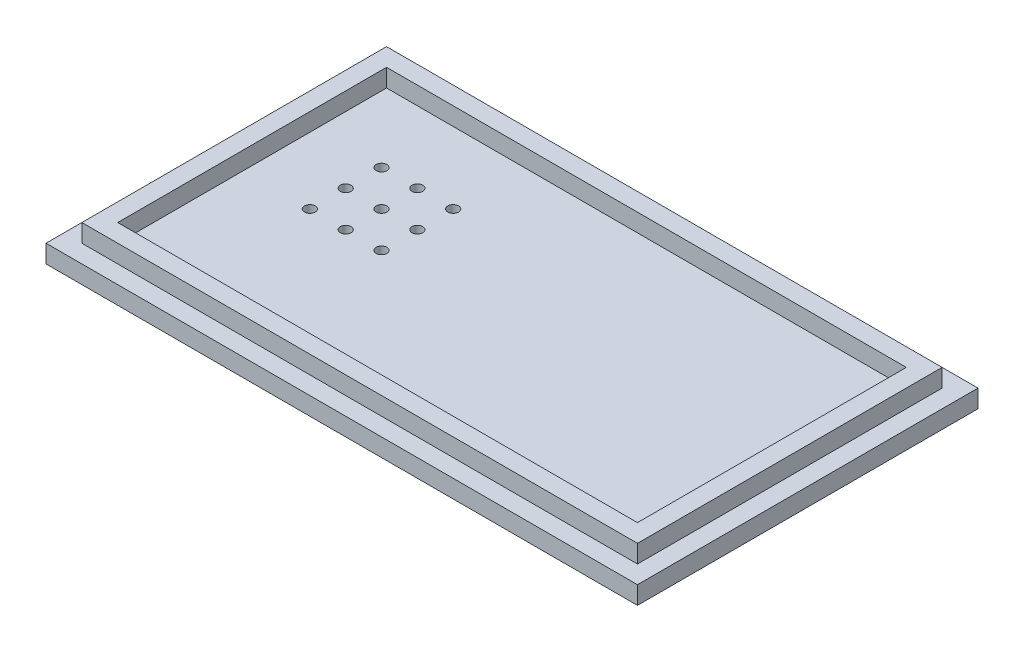
ISO-10303-21;
HEADER;
FILE_DESCRIPTION(('STEP AP214'),'2;1');
FILE_NAME('part.step','',(''),(''),'','','');
FILE_SCHEMA(('AUTOMOTIVE_DESIGN { 1 0 10303 214 1 1 1 1 }'));
ENDSEC;
DATA;
#1=APPLICATION_CONTEXT('core data for automotive mechanical design processes');
#2=APPLICATION_PROTOCOL_DEFINITION('international standard','automotive_design',2000,#1);
#3=PRODUCT_CONTEXT('',#1,'mechanical');
#4=PRODUCT('Part','Part','',(#3));
#5=PRODUCT_RELATED_PRODUCT_CATEGORY('part','',(#4));
#6=PRODUCT_DEFINITION_FORMATION('','',#4);
#7=PRODUCT_DEFINITION_CONTEXT('part definition',#1,'design');
#8=PRODUCT_DEFINITION('design','',#6,#7);
#9=PRODUCT_DEFINITION_SHAPE('','',#8);
#10=(LENGTH_UNIT() NAMED_UNIT(*) SI_UNIT(.MILLI.,.METRE.));
#11=(NAMED_UNIT(*) PLANE_ANGLE_UNIT() SI_UNIT($,.RADIAN.));
#12=(NAMED_UNIT(*) SI_UNIT($,.STERADIAN.) SOLID_ANGLE_UNIT());
#13=UNCERTAINTY_MEASURE_WITH_UNIT(LENGTH_MEASURE(1.E-05),#10,'distance_accuracy_value','');
#14=(GEOMETRIC_REPRESENTATION_CONTEXT(3) GLOBAL_UNCERTAINTY_ASSIGNED_CONTEXT((#13)) GLOBAL_UNIT_ASSIGNED_CONTEXT((#10,
#11,#12)) REPRESENTATION_CONTEXT('',''));
#15=CARTESIAN_POINT('',(0.,0.,0.));
#16=DIRECTION('',(0.,0.,1.));
#17=DIRECTION('',(1.,0.,0.));
#18=AXIS2_PLACEMENT_3D('',#15,#16,#17);
#19=CARTESIAN_POINT('',(0.,5.,0.));
#20=DIRECTION('',(0.,1.,0.));
#21=DIRECTION('',(0.,0.,1.));
#22=AXIS2_PLACEMENT_3D('',#19,#20,#21);
#23=PLANE('',#22);
#24=DIRECTION('',(0.,0.,-1.));
#25=VECTOR('',#24,1.);
#26=CARTESIAN_POINT('',(82.5,5.,-47.5));
#27=LINE('',#26,#25);
#28=CARTESIAN_POINT('',(82.5,5.,47.5));
#29=VERTEX_POINT('',#28);
#30=CARTESIAN_POINT('',(82.5,5.,-47.5));
#31=VERTEX_POINT('',#30);
#32=EDGE_CURVE('E192',#29,#31,#27,.T.);
#33=ORIENTED_EDGE('',*,*,#32,.T.);
#34=DIRECTION('',(-1.,0.,0.));
#35=VECTOR('',#34,1.);
#36=CARTESIAN_POINT('',(-82.5,5.,-47.5));
#37=LINE('',#36,#35);
#38=CARTESIAN_POINT('',(-82.5,5.,-47.5));
#39=VERTEX_POINT('',#38);
#40=EDGE_CURVE('E195',#31,#39,#37,.T.);
#41=ORIENTED_EDGE('',*,*,#40,.T.);
#42=DIRECTION('',(0.,0.,1.));
#43=VECTOR('',#42,1.);
#44=CARTESIAN_POINT('',(-82.5,5.,-47.5));
#45=LINE('',#44,#43);
#46=CARTESIAN_POINT('',(-82.5,5.,47.5));
#47=VERTEX_POINT('',#46);
#48=EDGE_CURVE('E198',#39,#47,#45,.T.);
#49=ORIENTED_EDGE('',*,*,#48,.T.);
#50=DIRECTION('',(1.,0.,0.));
#51=VECTOR('',#50,1.);
#52=CARTESIAN_POINT('',(-82.5,5.,47.5));
#53=LINE('',#52,#51);
#54=EDGE_CURVE('E200',#47,#29,#53,.T.);
#55=ORIENTED_EDGE('',*,*,#54,.T.);
#56=EDGE_LOOP('',(#33,#41,#49,#55));
#57=FACE_BOUND('',#56,.T.);
#58=DIRECTION('',(-1.,0.,0.));
#59=VECTOR('',#58,1.);
#60=CARTESIAN_POINT('',(-77.5,5.,-42.5));
#61=LINE('',#60,#59);
#62=CARTESIAN_POINT('',(77.5,5.,-42.5));
#63=VERTEX_POINT('',#62);
#64=CARTESIAN_POINT('',(-77.5,5.,-42.5));
#65=VERTEX_POINT('',#64);
#66=EDGE_CURVE('E178',#63,#65,#61,.T.);
#67=ORIENTED_EDGE('',*,*,#66,.F.);
#68=DIRECTION('',(0.,0.,-1.));
#69=VECTOR('',#68,1.);
#70=CARTESIAN_POINT('',(77.5,5.,-42.5));
#71=LINE('',#70,#69);
#72=CARTESIAN_POINT('',(77.5,5.,42.5));
#73=VERTEX_POINT('',#72);
#74=EDGE_CURVE('E141',#73,#63,#71,.T.);
#75=ORIENTED_EDGE('',*,*,#74,.F.);
#76=DIRECTION('',(1.,0.,0.));
#77=VECTOR('',#76,1.);
#78=CARTESIAN_POINT('',(-77.5,5.,42.5));
#79=LINE('',#78,#77);
#80=CARTESIAN_POINT('',(-77.5,5.,42.5));
#81=VERTEX_POINT('',#80);
#82=EDGE_CURVE('E169',#81,#73,#79,.T.);
#83=ORIENTED_EDGE('',*,*,#82,.F.);
#84=DIRECTION('',(0.,0.,1.));
#85=VECTOR('',#84,1.);
#86=CARTESIAN_POINT('',(-77.5,5.,-42.5));
#87=LINE('',#86,#85);
#88=EDGE_CURVE('E180',#65,#81,#87,.T.);
#89=ORIENTED_EDGE('',*,*,#88,.F.);
#90=EDGE_LOOP('',(#67,#75,#83,#89));
#91=FACE_BOUND('',#90,.T.);
#92=ADVANCED_FACE('F33',(#57,#91),#23,.T.);
#93=CARTESIAN_POINT('',(82.5,5.,-47.5));
#94=DIRECTION('',(-1.,0.,0.));
#95=DIRECTION('',(0.,0.,1.));
#96=AXIS2_PLACEMENT_3D('',#93,#94,#95);
#97=PLANE('',#96);
#98=DIRECTION('',(0.,0.,-1.));
#99=VECTOR('',#98,1.);
#100=CARTESIAN_POINT('',(82.5,0.,-47.5));
#101=LINE('',#100,#99);
#102=CARTESIAN_POINT('',(82.5,0.,47.5));
#103=VERTEX_POINT('',#102);
#104=CARTESIAN_POINT('',(82.5,0.,-47.5));
#105=VERTEX_POINT('',#104);
#106=EDGE_CURVE('E191',#103,#105,#101,.T.);
#107=ORIENTED_EDGE('',*,*,#106,.T.);
#108=DIRECTION('',(0.,-1.,0.));
#109=VECTOR('',#108,1.);
#110=CARTESIAN_POINT('',(82.5,5.,-47.5));
#111=LINE('',#110,#109);
#112=EDGE_CURVE('E11',#31,#105,#111,.T.);
#113=ORIENTED_EDGE('',*,*,#112,.F.);
#114=ORIENTED_EDGE('',*,*,#32,.F.);
#115=DIRECTION('',(0.,-1.,0.));
#116=VECTOR('',#115,1.);
#117=CARTESIAN_POINT('',(82.5,5.,47.5));
#118=LINE('',#117,#116);
#119=EDGE_CURVE('E202',#29,#103,#118,.T.);
#120=ORIENTED_EDGE('',*,*,#119,.T.);
#121=EDGE_LOOP('',(#107,#113,#114,#120));
#122=FACE_BOUND('',#121,.T.);
#123=ADVANCED_FACE('F35',(#122),#97,.F.);
#124=CARTESIAN_POINT('',(-82.5,5.,-47.5));
#125=DIRECTION('',(0.,0.,1.));
#126=DIRECTION('',(1.,0.,0.));
#127=AXIS2_PLACEMENT_3D('',#124,#125,#126);
#128=PLANE('',#127);
#129=DIRECTION('',(-1.,0.,0.));
#130=VECTOR('',#129,1.);
#131=CARTESIAN_POINT('',(-82.5,0.,-47.5));
#132=LINE('',#131,#130);
#133=CARTESIAN_POINT('',(-82.5,0.,-47.5));
#134=VERTEX_POINT('',#133);
#135=EDGE_CURVE('E205',#105,#134,#132,.T.);
#136=ORIENTED_EDGE('',*,*,#135,.T.);
#137=DIRECTION('',(0.,-1.,0.));
#138=VECTOR('',#137,1.);
#139=CARTESIAN_POINT('',(-82.5,5.,-47.5));
#140=LINE('',#139,#138);
#141=EDGE_CURVE('E41',#39,#134,#140,.T.);
#142=ORIENTED_EDGE('',*,*,#141,.F.);
#143=ORIENTED_EDGE('',*,*,#40,.F.);
#144=ORIENTED_EDGE('',*,*,#112,.T.);
#145=EDGE_LOOP('',(#136,#142,#143,#144));
#146=FACE_BOUND('',#145,.T.);
#147=ADVANCED_FACE('F235',(#146),#128,.F.);
#148=CARTESIAN_POINT('',(-82.5,5.,-47.5));
#149=DIRECTION('',(1.,0.,0.));
#150=DIRECTION('',(0.,0.,-1.));
#151=AXIS2_PLACEMENT_3D('',#148,#149,#150);
#152=PLANE('',#151);
#153=DIRECTION('',(0.,0.,1.));
#154=VECTOR('',#153,1.);
#155=CARTESIAN_POINT('',(-82.5,0.,-47.5));
#156=LINE('',#155,#154);
#157=CARTESIAN_POINT('',(-82.5,0.,47.5));
#158=VERTEX_POINT('',#157);
#159=EDGE_CURVE('E207',#134,#158,#156,.T.);
#160=ORIENTED_EDGE('',*,*,#159,.T.);
#161=DIRECTION('',(0.,-1.,0.));
#162=VECTOR('',#161,1.);
#163=CARTESIAN_POINT('',(-82.5,5.,47.5));
#164=LINE('',#163,#162);
#165=EDGE_CURVE('E212',#47,#158,#164,.T.);
#166=ORIENTED_EDGE('',*,*,#165,.F.);
#167=ORIENTED_EDGE('',*,*,#48,.F.);
#168=ORIENTED_EDGE('',*,*,#141,.T.);
#169=EDGE_LOOP('',(#160,#166,#167,#168));
#170=FACE_BOUND('',#169,.T.);
#171=ADVANCED_FACE('F219',(#170),#152,.F.);
#172=CARTESIAN_POINT('',(-82.5,5.,47.5));
#173=DIRECTION('',(0.,0.,-1.));
#174=DIRECTION('',(-1.,0.,0.));
#175=AXIS2_PLACEMENT_3D('',#172,#173,#174);
#176=PLANE('',#175);
#177=DIRECTION('',(1.,0.,0.));
#178=VECTOR('',#177,1.);
#179=CARTESIAN_POINT('',(-82.5,0.,47.5));
#180=LINE('',#179,#178);
#181=EDGE_CURVE('E196',#158,#103,#180,.T.);
#182=ORIENTED_EDGE('',*,*,#181,.T.);
#183=ORIENTED_EDGE('',*,*,#119,.F.);
#184=ORIENTED_EDGE('',*,*,#54,.F.);
#185=ORIENTED_EDGE('',*,*,#165,.T.);
#186=EDGE_LOOP('',(#182,#183,#184,#185));
#187=FACE_BOUND('',#186,.T.);
#188=ADVANCED_FACE('F228',(#187),#176,.F.);
#189=CARTESIAN_POINT('',(0.,0.,0.));
#190=DIRECTION('',(0.,1.,0.));
#191=DIRECTION('',(0.,0.,1.));
#192=AXIS2_PLACEMENT_3D('',#189,#190,#191);
#193=PLANE('',#192);
#194=CARTESIAN_POINT('',(-43.9734014380998,0.,-17.5727353519395));
#195=DIRECTION('',(0.,1.,0.));
#196=DIRECTION('',(0.,0.,1.));
#197=AXIS2_PLACEMENT_3D('',#194,#195,#196);
#198=CIRCLE('',#197,1.5);
#199=CARTESIAN_POINT('',(-43.9734014380998,0.,-16.0727353519395));
#200=VERTEX_POINT('',#199);
#201=EDGE_CURVE('E299',#200,#200,#198,.F.);
#202=ORIENTED_EDGE('',*,*,#201,.F.);
#203=EDGE_LOOP('',(#202));
#204=FACE_BOUND('',#203,.T.);
#205=CARTESIAN_POINT('',(-33.9734014380998,0.,-17.5727353519395));
#206=DIRECTION('',(0.,1.,0.));
#207=DIRECTION('',(0.,0.,1.));
#208=AXIS2_PLACEMENT_3D('',#205,#206,#207);
#209=CIRCLE('',#208,1.5);
#210=CARTESIAN_POINT('',(-33.9734014380998,0.,-16.0727353519395));
#211=VERTEX_POINT('',#210);
#212=EDGE_CURVE('E314',#211,#211,#209,.F.);
#213=ORIENTED_EDGE('',*,*,#212,.F.);
#214=EDGE_LOOP('',(#213));
#215=FACE_BOUND('',#214,.T.);
#216=CARTESIAN_POINT('',(-43.9734014380997,0.,-7.57273535193949));
#217=DIRECTION('',(0.,1.,0.));
#218=DIRECTION('',(0.,0.,1.));
#219=AXIS2_PLACEMENT_3D('',#216,#217,#218);
#220=CIRCLE('',#219,1.5);
#221=CARTESIAN_POINT('',(-43.9734014380997,0.,-6.07273535193948));
#222=VERTEX_POINT('',#221);
#223=EDGE_CURVE('E310',#222,#222,#220,.F.);
#224=ORIENTED_EDGE('',*,*,#223,.F.);
#225=EDGE_LOOP('',(#224));
#226=FACE_BOUND('',#225,.T.);
#227=CARTESIAN_POINT('',(-33.9734014380997,0.,-7.57273535193949));
#228=DIRECTION('',(0.,1.,0.));
#229=DIRECTION('',(0.,0.,1.));
#230=AXIS2_PLACEMENT_3D('',#227,#228,#229);
#231=CIRCLE('',#230,1.50000000000001);
#232=CARTESIAN_POINT('',(-33.9734014380997,0.,-6.07273535193948));
#233=VERTEX_POINT('',#232);
#234=EDGE_CURVE('E305',#233,#233,#231,.F.);
#235=ORIENTED_EDGE('',*,*,#234,.F.);
#236=EDGE_LOOP('',(#235));
#237=FACE_BOUND('',#236,.T.);
#238=CARTESIAN_POINT('',(-43.9734014380996,0.,2.42726464806051));
#239=DIRECTION('',(0.,1.,0.));
#240=DIRECTION('',(0.,0.,1.));
#241=AXIS2_PLACEMENT_3D('',#238,#239,#240);
#242=CIRCLE('',#241,1.5);
#243=CARTESIAN_POINT('',(-43.9734014380996,0.,3.92726464806052));
#244=VERTEX_POINT('',#243);
#245=EDGE_CURVE('E309',#244,#244,#242,.F.);
#246=ORIENTED_EDGE('',*,*,#245,.F.);
#247=EDGE_LOOP('',(#246));
#248=FACE_BOUND('',#247,.T.);
#249=CARTESIAN_POINT('',(-33.9734014380996,0.,2.42726464806051));
#250=DIRECTION('',(0.,1.,0.));
#251=DIRECTION('',(0.,0.,1.));
#252=AXIS2_PLACEMENT_3D('',#249,#250,#251);
#253=CIRCLE('',#252,1.5);
#254=CARTESIAN_POINT('',(-33.9734014380996,0.,3.92726464806051));
#255=VERTEX_POINT('',#254);
#256=EDGE_CURVE('E327',#255,#255,#253,.F.);
#257=ORIENTED_EDGE('',*,*,#256,.F.);
#258=EDGE_LOOP('',(#257));
#259=FACE_BOUND('',#258,.T.);
#260=CARTESIAN_POINT('',(-53.9734014380997,0.,-7.57273535193949));
#261=DIRECTION('',(0.,1.,0.));
#262=DIRECTION('',(0.,0.,1.));
#263=AXIS2_PLACEMENT_3D('',#260,#261,#262);
#264=CIRCLE('',#263,1.5);
#265=CARTESIAN_POINT('',(-53.9734014380997,0.,-6.07273535193948));
#266=VERTEX_POINT('',#265);
#267=EDGE_CURVE('E323',#266,#266,#264,.F.);
#268=ORIENTED_EDGE('',*,*,#267,.F.);
#269=EDGE_LOOP('',(#268));
#270=FACE_BOUND('',#269,.T.);
#271=CARTESIAN_POINT('',(-53.9734014380996,0.,2.42726464806051));
#272=DIRECTION('',(0.,1.,0.));
#273=DIRECTION('',(0.,0.,1.));
#274=AXIS2_PLACEMENT_3D('',#271,#272,#273);
#275=CIRCLE('',#274,1.5);
#276=CARTESIAN_POINT('',(-53.9734014380996,0.,3.92726464806052));
#277=VERTEX_POINT('',#276);
#278=EDGE_CURVE('E319',#277,#277,#275,.F.);
#279=ORIENTED_EDGE('',*,*,#278,.F.);
#280=EDGE_LOOP('',(#279));
#281=FACE_BOUND('',#280,.T.);
#282=CARTESIAN_POINT('',(-53.9734014380998,0.,-17.5727353519395));
#283=DIRECTION('',(0.,1.,0.));
#284=DIRECTION('',(0.,0.,1.));
#285=AXIS2_PLACEMENT_3D('',#282,#283,#284);
#286=CIRCLE('',#285,1.5);
#287=CARTESIAN_POINT('',(-53.9734014380998,0.,-16.0727353519395));
#288=VERTEX_POINT('',#287);
#289=EDGE_CURVE('E155',#288,#288,#286,.F.);
#290=ORIENTED_EDGE('',*,*,#289,.F.);
#291=EDGE_LOOP('',(#290));
#292=FACE_BOUND('',#291,.T.);
#293=ORIENTED_EDGE('',*,*,#106,.F.);
#294=ORIENTED_EDGE('',*,*,#181,.F.);
#295=ORIENTED_EDGE('',*,*,#159,.F.);
#296=ORIENTED_EDGE('',*,*,#135,.F.);
#297=EDGE_LOOP('',(#293,#294,#295,#296));
#298=FACE_BOUND('',#297,.T.);
#299=ADVANCED_FACE('F225',(#204,#215,#226,#237,#248,#259,#270,#281,#292,#298),#193,.F.);
#300=CARTESIAN_POINT('',(0.,10.,0.));
#301=DIRECTION('',(0.,1.,0.));
#302=DIRECTION('',(0.,0.,1.));
#303=AXIS2_PLACEMENT_3D('',#300,#301,#302);
#304=PLANE('',#303);
#305=DIRECTION('',(0.,0.,-1.));
#306=VECTOR('',#305,1.);
#307=CARTESIAN_POINT('',(77.5,10.,-42.5));
#308=LINE('',#307,#306);
#309=CARTESIAN_POINT('',(77.5,10.,42.5));
#310=VERTEX_POINT('',#309);
#311=CARTESIAN_POINT('',(77.5,10.,-42.5));
#312=VERTEX_POINT('',#311);
#313=EDGE_CURVE('E165',#310,#312,#308,.T.);
#314=ORIENTED_EDGE('',*,*,#313,.T.);
#315=DIRECTION('',(-1.,0.,0.));
#316=VECTOR('',#315,1.);
#317=CARTESIAN_POINT('',(-77.5,10.,-42.5));
#318=LINE('',#317,#316);
#319=CARTESIAN_POINT('',(-77.5,10.,-42.5));
#320=VERTEX_POINT('',#319);
#321=EDGE_CURVE('E168',#312,#320,#318,.T.);
#322=ORIENTED_EDGE('',*,*,#321,.T.);
#323=DIRECTION('',(0.,0.,1.));
#324=VECTOR('',#323,1.);
#325=CARTESIAN_POINT('',(-77.5,10.,-42.5));
#326=LINE('',#325,#324);
#327=CARTESIAN_POINT('',(-77.5,10.,42.5));
#328=VERTEX_POINT('',#327);
#329=EDGE_CURVE('E171',#320,#328,#326,.T.);
#330=ORIENTED_EDGE('',*,*,#329,.T.);
#331=DIRECTION('',(1.,0.,0.));
#332=VECTOR('',#331,1.);
#333=CARTESIAN_POINT('',(-77.5,10.,42.5));
#334=LINE('',#333,#332);
#335=EDGE_CURVE('E173',#328,#310,#334,.T.);
#336=ORIENTED_EDGE('',*,*,#335,.T.);
#337=EDGE_LOOP('',(#314,#322,#330,#336));
#338=FACE_BOUND('',#337,.T.);
#339=DIRECTION('',(-1.,0.,0.));
#340=VECTOR('',#339,1.);
#341=CARTESIAN_POINT('',(-72.5,10.,-37.5));
#342=LINE('',#341,#340);
#343=CARTESIAN_POINT('',(72.5,10.,-37.5));
#344=VERTEX_POINT('',#343);
#345=CARTESIAN_POINT('',(-72.5,10.,-37.5));
#346=VERTEX_POINT('',#345);
#347=EDGE_CURVE('E133',#344,#346,#342,.T.);
#348=ORIENTED_EDGE('',*,*,#347,.F.);
#349=DIRECTION('',(0.,0.,-1.));
#350=VECTOR('',#349,1.);
#351=CARTESIAN_POINT('',(72.5,10.,-37.5));
#352=LINE('',#351,#350);
#353=CARTESIAN_POINT('',(72.5,10.,37.5));
#354=VERTEX_POINT('',#353);
#355=EDGE_CURVE('E124',#354,#344,#352,.T.);
#356=ORIENTED_EDGE('',*,*,#355,.F.);
#357=DIRECTION('',(1.,0.,0.));
#358=VECTOR('',#357,1.);
#359=CARTESIAN_POINT('',(-72.5,10.,37.5));
#360=LINE('',#359,#358);
#361=CARTESIAN_POINT('',(-72.5,10.,37.5));
#362=VERTEX_POINT('',#361);
#363=EDGE_CURVE('E149',#362,#354,#360,.T.);
#364=ORIENTED_EDGE('',*,*,#363,.F.);
#365=DIRECTION('',(0.,0.,1.));
#366=VECTOR('',#365,1.);
#367=CARTESIAN_POINT('',(-72.5,10.,-37.5));
#368=LINE('',#367,#366);
#369=EDGE_CURVE('E147',#346,#362,#368,.T.);
#370=ORIENTED_EDGE('',*,*,#369,.F.);
#371=EDGE_LOOP('',(#348,#356,#364,#370));
#372=FACE_BOUND('',#371,.T.);
#373=ADVANCED_FACE('F145',(#338,#372),#304,.T.);
#374=CARTESIAN_POINT('',(77.5,10.,-42.5));
#375=DIRECTION('',(-1.,0.,0.));
#376=DIRECTION('',(0.,0.,1.));
#377=AXIS2_PLACEMENT_3D('',#374,#375,#376);
#378=PLANE('',#377);
#379=ORIENTED_EDGE('',*,*,#74,.T.);
#380=DIRECTION('',(0.,-1.,0.));
#381=VECTOR('',#380,1.);
#382=CARTESIAN_POINT('',(77.5,10.,-42.5));
#383=LINE('',#382,#381);
#384=EDGE_CURVE('E189',#312,#63,#383,.T.);
#385=ORIENTED_EDGE('',*,*,#384,.F.);
#386=ORIENTED_EDGE('',*,*,#313,.F.);
#387=DIRECTION('',(0.,-1.,0.));
#388=VECTOR('',#387,1.);
#389=CARTESIAN_POINT('',(77.5,10.,42.5));
#390=LINE('',#389,#388);
#391=EDGE_CURVE('E175',#310,#73,#390,.T.);
#392=ORIENTED_EDGE('',*,*,#391,.T.);
#393=EDGE_LOOP('',(#379,#385,#386,#392));
#394=FACE_BOUND('',#393,.T.);
#395=ADVANCED_FACE('F378',(#394),#378,.F.);
#396=CARTESIAN_POINT('',(-77.5,10.,-42.5));
#397=DIRECTION('',(0.,0.,1.));
#398=DIRECTION('',(1.,0.,0.));
#399=AXIS2_PLACEMENT_3D('',#396,#397,#398);
#400=PLANE('',#399);
#401=ORIENTED_EDGE('',*,*,#66,.T.);
#402=DIRECTION('',(0.,-1.,0.));
#403=VECTOR('',#402,1.);
#404=CARTESIAN_POINT('',(-77.5,10.,-42.5));
#405=LINE('',#404,#403);
#406=EDGE_CURVE('E186',#320,#65,#405,.T.);
#407=ORIENTED_EDGE('',*,*,#406,.F.);
#408=ORIENTED_EDGE('',*,*,#321,.F.);
#409=ORIENTED_EDGE('',*,*,#384,.T.);
#410=EDGE_LOOP('',(#401,#407,#408,#409));
#411=FACE_BOUND('',#410,.T.);
#412=ADVANCED_FACE('F385',(#411),#400,.F.);
#413=CARTESIAN_POINT('',(-77.5,10.,-42.5));
#414=DIRECTION('',(1.,0.,0.));
#415=DIRECTION('',(0.,0.,-1.));
#416=AXIS2_PLACEMENT_3D('',#413,#414,#415);
#417=PLANE('',#416);
#418=ORIENTED_EDGE('',*,*,#88,.T.);
#419=DIRECTION('',(0.,-1.,0.));
#420=VECTOR('',#419,1.);
#421=CARTESIAN_POINT('',(-77.5,10.,42.5));
#422=LINE('',#421,#420);
#423=EDGE_CURVE('E48',#328,#81,#422,.T.);
#424=ORIENTED_EDGE('',*,*,#423,.F.);
#425=ORIENTED_EDGE('',*,*,#329,.F.);
#426=ORIENTED_EDGE('',*,*,#406,.T.);
#427=EDGE_LOOP('',(#418,#424,#425,#426));
#428=FACE_BOUND('',#427,.T.);
#429=ADVANCED_FACE('F382',(#428),#417,.F.);
#430=CARTESIAN_POINT('',(-77.5,10.,42.5));
#431=DIRECTION('',(0.,0.,-1.));
#432=DIRECTION('',(-1.,0.,0.));
#433=AXIS2_PLACEMENT_3D('',#430,#431,#432);
#434=PLANE('',#433);
#435=ORIENTED_EDGE('',*,*,#82,.T.);
#436=ORIENTED_EDGE('',*,*,#391,.F.);
#437=ORIENTED_EDGE('',*,*,#335,.F.);
#438=ORIENTED_EDGE('',*,*,#423,.T.);
#439=EDGE_LOOP('',(#435,#436,#437,#438));
#440=FACE_BOUND('',#439,.T.);
#441=ADVANCED_FACE('F375',(#440),#434,.F.);
#442=CARTESIAN_POINT('',(72.5,10.,-37.5));
#443=DIRECTION('',(-1.,0.,0.));
#444=DIRECTION('',(0.,0.,1.));
#445=AXIS2_PLACEMENT_3D('',#442,#443,#444);
#446=PLANE('',#445);
#447=DIRECTION('',(0.,0.,-1.));
#448=VECTOR('',#447,1.);
#449=CARTESIAN_POINT('',(72.5,5.,-37.5));
#450=LINE('',#449,#448);
#451=CARTESIAN_POINT('',(72.5,5.,37.5));
#452=VERTEX_POINT('',#451);
#453=CARTESIAN_POINT('',(72.5,5.,-37.5));
#454=VERTEX_POINT('',#453);
#455=EDGE_CURVE('E56',#452,#454,#450,.T.);
#456=ORIENTED_EDGE('',*,*,#455,.F.);
#457=DIRECTION('',(0.,-1.,0.));
#458=VECTOR('',#457,1.);
#459=CARTESIAN_POINT('',(72.5,10.,37.5));
#460=LINE('',#459,#458);
#461=EDGE_CURVE('E129',#354,#452,#460,.T.);
#462=ORIENTED_EDGE('',*,*,#461,.F.);
#463=ORIENTED_EDGE('',*,*,#355,.T.);
#464=DIRECTION('',(0.,-1.,0.));
#465=VECTOR('',#464,1.);
#466=CARTESIAN_POINT('',(72.5,10.,-37.5));
#467=LINE('',#466,#465);
#468=EDGE_CURVE('E127',#344,#454,#467,.T.);
#469=ORIENTED_EDGE('',*,*,#468,.T.);
#470=EDGE_LOOP('',(#456,#462,#463,#469));
#471=FACE_BOUND('',#470,.T.);
#472=ADVANCED_FACE('F126',(#471),#446,.T.);
#473=CARTESIAN_POINT('',(-72.5,10.,-37.5));
#474=DIRECTION('',(0.,0.,1.));
#475=DIRECTION('',(1.,0.,0.));
#476=AXIS2_PLACEMENT_3D('',#473,#474,#475);
#477=PLANE('',#476);
#478=DIRECTION('',(-1.,0.,0.));
#479=VECTOR('',#478,1.);
#480=CARTESIAN_POINT('',(-72.5,5.,-37.5));
#481=LINE('',#480,#479);
#482=CARTESIAN_POINT('',(-72.5,5.,-37.5));
#483=VERTEX_POINT('',#482);
#484=EDGE_CURVE('E140',#454,#483,#481,.T.);
#485=ORIENTED_EDGE('',*,*,#484,.F.);
#486=ORIENTED_EDGE('',*,*,#468,.F.);
#487=ORIENTED_EDGE('',*,*,#347,.T.);
#488=DIRECTION('',(0.,-1.,0.));
#489=VECTOR('',#488,1.);
#490=CARTESIAN_POINT('',(-72.5,10.,-37.5));
#491=LINE('',#490,#489);
#492=EDGE_CURVE('E142',#346,#483,#491,.T.);
#493=ORIENTED_EDGE('',*,*,#492,.T.);
#494=EDGE_LOOP('',(#485,#486,#487,#493));
#495=FACE_BOUND('',#494,.T.);
#496=ADVANCED_FACE('F137',(#495),#477,.T.);
#497=CARTESIAN_POINT('',(-72.5,10.,-37.5));
#498=DIRECTION('',(1.,0.,0.));
#499=DIRECTION('',(0.,0.,-1.));
#500=AXIS2_PLACEMENT_3D('',#497,#498,#499);
#501=PLANE('',#500);
#502=DIRECTION('',(0.,0.,1.));
#503=VECTOR('',#502,1.);
#504=CARTESIAN_POINT('',(-72.5,5.,-37.5));
#505=LINE('',#504,#503);
#506=CARTESIAN_POINT('',(-72.5,5.,37.5));
#507=VERTEX_POINT('',#506);
#508=EDGE_CURVE('E157',#483,#507,#505,.T.);
#509=ORIENTED_EDGE('',*,*,#508,.F.);
#510=ORIENTED_EDGE('',*,*,#492,.F.);
#511=ORIENTED_EDGE('',*,*,#369,.T.);
#512=DIRECTION('',(0.,-1.,0.));
#513=VECTOR('',#512,1.);
#514=CARTESIAN_POINT('',(-72.5,10.,37.5));
#515=LINE('',#514,#513);
#516=EDGE_CURVE('E161',#362,#507,#515,.T.);
#517=ORIENTED_EDGE('',*,*,#516,.T.);
#518=EDGE_LOOP('',(#509,#510,#511,#517));
#519=FACE_BOUND('',#518,.T.);
#520=ADVANCED_FACE('F260',(#519),#501,.T.);
#521=CARTESIAN_POINT('',(-72.5,10.,37.5));
#522=DIRECTION('',(0.,0.,-1.));
#523=DIRECTION('',(-1.,0.,0.));
#524=AXIS2_PLACEMENT_3D('',#521,#522,#523);
#525=PLANE('',#524);
#526=DIRECTION('',(1.,0.,0.));
#527=VECTOR('',#526,1.);
#528=CARTESIAN_POINT('',(-72.5,5.,37.5));
#529=LINE('',#528,#527);
#530=EDGE_CURVE('E134',#507,#452,#529,.T.);
#531=ORIENTED_EDGE('',*,*,#530,.F.);
#532=ORIENTED_EDGE('',*,*,#516,.F.);
#533=ORIENTED_EDGE('',*,*,#363,.T.);
#534=ORIENTED_EDGE('',*,*,#461,.T.);
#535=EDGE_LOOP('',(#531,#532,#533,#534));
#536=FACE_BOUND('',#535,.T.);
#537=ADVANCED_FACE('F251',(#536),#525,.T.);
#538=CARTESIAN_POINT('',(-43.9734014380998,5.,-17.5727353519395));
#539=DIRECTION('',(0.,1.,0.));
#540=DIRECTION('',(0.,0.,1.));
#541=AXIS2_PLACEMENT_3D('',#538,#539,#540);
#542=CIRCLE('',#541,1.5);
#543=CARTESIAN_POINT('',(-43.9734014380998,5.,-16.0727353519395));
#544=VERTEX_POINT('',#543);
#545=EDGE_CURVE('E266',#544,#544,#542,.T.);
#546=ORIENTED_EDGE('',*,*,#545,.F.);
#547=EDGE_LOOP('',(#546));
#548=FACE_BOUND('',#547,.T.);
#549=CARTESIAN_POINT('',(-33.9734014380998,5.,-17.5727353519395));
#550=DIRECTION('',(0.,1.,0.));
#551=DIRECTION('',(0.,0.,1.));
#552=AXIS2_PLACEMENT_3D('',#549,#550,#551);
#553=CIRCLE('',#552,1.5);
#554=CARTESIAN_POINT('',(-33.9734014380998,5.,-16.0727353519395));
#555=VERTEX_POINT('',#554);
#556=EDGE_CURVE('E270',#555,#555,#553,.T.);
#557=ORIENTED_EDGE('',*,*,#556,.F.);
#558=EDGE_LOOP('',(#557));
#559=FACE_BOUND('',#558,.T.);
#560=CARTESIAN_POINT('',(-43.9734014380997,5.,-7.57273535193949));
#561=DIRECTION('',(0.,1.,0.));
#562=DIRECTION('',(0.,0.,1.));
#563=AXIS2_PLACEMENT_3D('',#560,#561,#562);
#564=CIRCLE('',#563,1.5);
#565=CARTESIAN_POINT('',(-43.9734014380997,5.,-6.07273535193948));
#566=VERTEX_POINT('',#565);
#567=EDGE_CURVE('E274',#566,#566,#564,.T.);
#568=ORIENTED_EDGE('',*,*,#567,.F.);
#569=EDGE_LOOP('',(#568));
#570=FACE_BOUND('',#569,.T.);
#571=CARTESIAN_POINT('',(-33.9734014380997,5.,-7.57273535193949));
#572=DIRECTION('',(0.,1.,0.));
#573=DIRECTION('',(0.,0.,1.));
#574=AXIS2_PLACEMENT_3D('',#571,#572,#573);
#575=CIRCLE('',#574,1.50000000000001);
#576=CARTESIAN_POINT('',(-33.9734014380997,5.,-6.07273535193948));
#577=VERTEX_POINT('',#576);
#578=EDGE_CURVE('E278',#577,#577,#575,.T.);
#579=ORIENTED_EDGE('',*,*,#578,.F.);
#580=EDGE_LOOP('',(#579));
#581=FACE_BOUND('',#580,.T.);
#582=CARTESIAN_POINT('',(-43.9734014380996,5.,2.42726464806051));
#583=DIRECTION('',(0.,1.,0.));
#584=DIRECTION('',(0.,0.,1.));
#585=AXIS2_PLACEMENT_3D('',#582,#583,#584);
#586=CIRCLE('',#585,1.5);
#587=CARTESIAN_POINT('',(-43.9734014380996,5.,3.92726464806052));
#588=VERTEX_POINT('',#587);
#589=EDGE_CURVE('E282',#588,#588,#586,.T.);
#590=ORIENTED_EDGE('',*,*,#589,.F.);
#591=EDGE_LOOP('',(#590));
#592=FACE_BOUND('',#591,.T.);
#593=CARTESIAN_POINT('',(-33.9734014380996,5.,2.42726464806051));
#594=DIRECTION('',(0.,1.,0.));
#595=DIRECTION('',(0.,0.,1.));
#596=AXIS2_PLACEMENT_3D('',#593,#594,#595);
#597=CIRCLE('',#596,1.5);
#598=CARTESIAN_POINT('',(-33.9734014380996,5.,3.92726464806051));
#599=VERTEX_POINT('',#598);
#600=EDGE_CURVE('E286',#599,#599,#597,.T.);
#601=ORIENTED_EDGE('',*,*,#600,.F.);
#602=EDGE_LOOP('',(#601));
#603=FACE_BOUND('',#602,.T.);
#604=CARTESIAN_POINT('',(-53.9734014380997,5.,-7.57273535193949));
#605=DIRECTION('',(0.,1.,0.));
#606=DIRECTION('',(0.,0.,1.));
#607=AXIS2_PLACEMENT_3D('',#604,#605,#606);
#608=CIRCLE('',#607,1.5);
#609=CARTESIAN_POINT('',(-53.9734014380997,5.,-6.07273535193948));
#610=VERTEX_POINT('',#609);
#611=EDGE_CURVE('E290',#610,#610,#608,.T.);
#612=ORIENTED_EDGE('',*,*,#611,.F.);
#613=EDGE_LOOP('',(#612));
#614=FACE_BOUND('',#613,.T.);
#615=CARTESIAN_POINT('',(-53.9734014380996,5.,2.42726464806051));
#616=DIRECTION('',(0.,1.,0.));
#617=DIRECTION('',(0.,0.,1.));
#618=AXIS2_PLACEMENT_3D('',#615,#616,#617);
#619=CIRCLE('',#618,1.5);
#620=CARTESIAN_POINT('',(-53.9734014380996,5.,3.92726464806052));
#621=VERTEX_POINT('',#620);
#622=EDGE_CURVE('E294',#621,#621,#619,.T.);
#623=ORIENTED_EDGE('',*,*,#622,.F.);
#624=EDGE_LOOP('',(#623));
#625=FACE_BOUND('',#624,.T.);
#626=CARTESIAN_POINT('',(-53.9734014380998,5.,-17.5727353519395));
#627=DIRECTION('',(0.,1.,0.));
#628=DIRECTION('',(0.,0.,1.));
#629=AXIS2_PLACEMENT_3D('',#626,#627,#628);
#630=CIRCLE('',#629,1.5);
#631=CARTESIAN_POINT('',(-53.9734014380998,5.,-16.0727353519395));
#632=VERTEX_POINT('',#631);
#633=EDGE_CURVE('E297',#632,#632,#630,.T.);
#634=ORIENTED_EDGE('',*,*,#633,.F.);
#635=EDGE_LOOP('',(#634));
#636=FACE_BOUND('',#635,.T.);
#637=ORIENTED_EDGE('',*,*,#455,.T.);
#638=ORIENTED_EDGE('',*,*,#484,.T.);
#639=ORIENTED_EDGE('',*,*,#508,.T.);
#640=ORIENTED_EDGE('',*,*,#530,.T.);
#641=EDGE_LOOP('',(#637,#638,#639,#640));
#642=FACE_BOUND('',#641,.T.);
#643=ADVANCED_FACE('F244',(#548,#559,#570,#581,#592,#603,#614,#625,#636,#642),#23,.T.);
#644=CARTESIAN_POINT('',(-53.9734014380998,-4.24264068711931,-17.5727353519395));
#645=DIRECTION('',(0.,1.,0.));
#646=DIRECTION('',(0.,0.,1.));
#647=AXIS2_PLACEMENT_3D('',#644,#645,#646);
#648=CYLINDRICAL_SURFACE('',#647,1.5);
#649=ORIENTED_EDGE('',*,*,#289,.T.);
#650=EDGE_LOOP('',(#649));
#651=FACE_BOUND('',#650,.T.);
#652=ORIENTED_EDGE('',*,*,#633,.T.);
#653=EDGE_LOOP('',(#652));
#654=FACE_BOUND('',#653,.T.);
#655=ADVANCED_FACE('F250',(#651,#654),#648,.F.);
#656=CARTESIAN_POINT('',(-53.9734014380996,-4.24264068711931,2.42726464806051));
#657=DIRECTION('',(0.,1.,0.));
#658=DIRECTION('',(0.,0.,1.));
#659=AXIS2_PLACEMENT_3D('',#656,#657,#658);
#660=CYLINDRICAL_SURFACE('',#659,1.5);
#661=ORIENTED_EDGE('',*,*,#278,.T.);
#662=EDGE_LOOP('',(#661));
#663=FACE_BOUND('',#662,.T.);
#664=ORIENTED_EDGE('',*,*,#622,.T.);
#665=EDGE_LOOP('',(#664));
#666=FACE_BOUND('',#665,.T.);
#667=ADVANCED_FACE('F257',(#663,#666),#660,.F.);
#668=CARTESIAN_POINT('',(-53.9734014380997,-4.24264068711931,-7.57273535193949));
#669=DIRECTION('',(0.,1.,0.));
#670=DIRECTION('',(0.,0.,1.));
#671=AXIS2_PLACEMENT_3D('',#668,#669,#670);
#672=CYLINDRICAL_SURFACE('',#671,1.5);
#673=ORIENTED_EDGE('',*,*,#267,.T.);
#674=EDGE_LOOP('',(#673));
#675=FACE_BOUND('',#674,.T.);
#676=ORIENTED_EDGE('',*,*,#611,.T.);
#677=EDGE_LOOP('',(#676));
#678=FACE_BOUND('',#677,.T.);
#679=ADVANCED_FACE('F347',(#675,#678),#672,.F.);
#680=CARTESIAN_POINT('',(-33.9734014380996,-4.24264068711931,2.42726464806051));
#681=DIRECTION('',(0.,1.,0.));
#682=DIRECTION('',(0.,0.,1.));
#683=AXIS2_PLACEMENT_3D('',#680,#681,#682);
#684=CYLINDRICAL_SURFACE('',#683,1.5);
#685=ORIENTED_EDGE('',*,*,#256,.T.);
#686=EDGE_LOOP('',(#685));
#687=FACE_BOUND('',#686,.T.);
#688=ORIENTED_EDGE('',*,*,#600,.T.);
#689=EDGE_LOOP('',(#688));
#690=FACE_BOUND('',#689,.T.);
#691=ADVANCED_FACE('F337',(#687,#690),#684,.F.);
#692=CARTESIAN_POINT('',(-43.9734014380996,-4.24264068711931,2.42726464806051));
#693=DIRECTION('',(0.,1.,0.));
#694=DIRECTION('',(0.,0.,1.));
#695=AXIS2_PLACEMENT_3D('',#692,#693,#694);
#696=CYLINDRICAL_SURFACE('',#695,1.5);
#697=ORIENTED_EDGE('',*,*,#245,.T.);
#698=EDGE_LOOP('',(#697));
#699=FACE_BOUND('',#698,.T.);
#700=ORIENTED_EDGE('',*,*,#589,.T.);
#701=EDGE_LOOP('',(#700));
#702=FACE_BOUND('',#701,.T.);
#703=ADVANCED_FACE('F334',(#699,#702),#696,.F.);
#704=CARTESIAN_POINT('',(-33.9734014380997,-4.24264068711931,-7.57273535193949));
#705=DIRECTION('',(0.,1.,0.));
#706=DIRECTION('',(0.,0.,1.));
#707=AXIS2_PLACEMENT_3D('',#704,#705,#706);
#708=CYLINDRICAL_SURFACE('',#707,1.50000000000001);
#709=ORIENTED_EDGE('',*,*,#234,.T.);
#710=EDGE_LOOP('',(#709));
#711=FACE_BOUND('',#710,.T.);
#712=ORIENTED_EDGE('',*,*,#578,.T.);
#713=EDGE_LOOP('',(#712));
#714=FACE_BOUND('',#713,.T.);
#715=ADVANCED_FACE('F336',(#711,#714),#708,.F.);
#716=CARTESIAN_POINT('',(-43.9734014380997,-4.24264068711931,-7.57273535193949));
#717=DIRECTION('',(0.,1.,0.));
#718=DIRECTION('',(0.,0.,1.));
#719=AXIS2_PLACEMENT_3D('',#716,#717,#718);
#720=CYLINDRICAL_SURFACE('',#719,1.5);
#721=ORIENTED_EDGE('',*,*,#223,.T.);
#722=EDGE_LOOP('',(#721));
#723=FACE_BOUND('',#722,.T.);
#724=ORIENTED_EDGE('',*,*,#567,.T.);
#725=EDGE_LOOP('',(#724));
#726=FACE_BOUND('',#725,.T.);
#727=ADVANCED_FACE('F344',(#723,#726),#720,.F.);
#728=CARTESIAN_POINT('',(-33.9734014380998,-4.24264068711931,-17.5727353519395));
#729=DIRECTION('',(0.,1.,0.));
#730=DIRECTION('',(0.,0.,1.));
#731=AXIS2_PLACEMENT_3D('',#728,#729,#730);
#732=CYLINDRICAL_SURFACE('',#731,1.5);
#733=ORIENTED_EDGE('',*,*,#212,.T.);
#734=EDGE_LOOP('',(#733));
#735=FACE_BOUND('',#734,.T.);
#736=ORIENTED_EDGE('',*,*,#556,.T.);
#737=EDGE_LOOP('',(#736));
#738=FACE_BOUND('',#737,.T.);
#739=ADVANCED_FACE('F360',(#735,#738),#732,.F.);
#740=CARTESIAN_POINT('',(-43.9734014380998,-4.24264068711931,-17.5727353519395));
#741=DIRECTION('',(0.,1.,0.));
#742=DIRECTION('',(0.,0.,1.));
#743=AXIS2_PLACEMENT_3D('',#740,#741,#742);
#744=CYLINDRICAL_SURFACE('',#743,1.5);
#745=ORIENTED_EDGE('',*,*,#201,.T.);
#746=EDGE_LOOP('',(#745));
#747=FACE_BOUND('',#746,.T.);
#748=ORIENTED_EDGE('',*,*,#545,.T.);
#749=EDGE_LOOP('',(#748));
#750=FACE_BOUND('',#749,.T.);
#751=ADVANCED_FACE('F357',(#747,#750),#744,.F.);
#752=CLOSED_SHELL('',(#92,#123,#147,#171,#188,#299,#373,#395,#412,#429,#441,#472,#496,#520,#537,
#643,#655,#667,#679,#691,#703,#715,#727,#739,#751));
#753=MANIFOLD_SOLID_BREP('B2',#752);
#754=ADVANCED_BREP_SHAPE_REPRESENTATION('',(#18,#753),#14);
#755=SHAPE_DEFINITION_REPRESENTATION(#9,#754);
ENDSEC;
END-ISO-10303-21;
